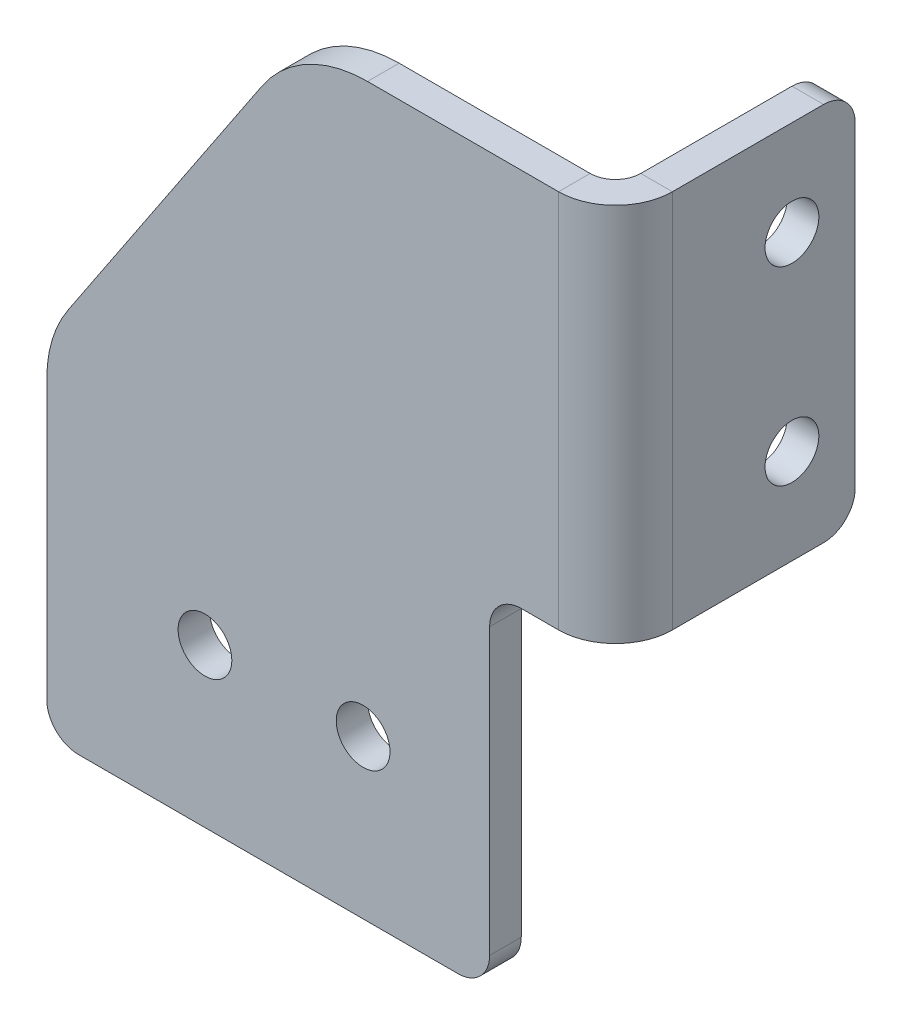
ISO-10303-21;
HEADER;
FILE_DESCRIPTION(('STEP AP214'),'2;1');
FILE_NAME('part.step','',(''),(''),'','','');
FILE_SCHEMA(('AUTOMOTIVE_DESIGN { 1 0 10303 214 1 1 1 1 }'));
ENDSEC;
DATA;
#1=APPLICATION_CONTEXT('core data for automotive mechanical design processes');
#2=APPLICATION_PROTOCOL_DEFINITION('international standard','automotive_design',2000,#1);
#3=PRODUCT_CONTEXT('',#1,'mechanical');
#4=PRODUCT('Part','Part','',(#3));
#5=PRODUCT_RELATED_PRODUCT_CATEGORY('part','',(#4));
#6=PRODUCT_DEFINITION_FORMATION('','',#4);
#7=PRODUCT_DEFINITION_CONTEXT('part definition',#1,'design');
#8=PRODUCT_DEFINITION('design','',#6,#7);
#9=PRODUCT_DEFINITION_SHAPE('','',#8);
#10=(LENGTH_UNIT() NAMED_UNIT(*) SI_UNIT(.MILLI.,.METRE.));
#11=(NAMED_UNIT(*) PLANE_ANGLE_UNIT() SI_UNIT($,.RADIAN.));
#12=(NAMED_UNIT(*) SI_UNIT($,.STERADIAN.) SOLID_ANGLE_UNIT());
#13=UNCERTAINTY_MEASURE_WITH_UNIT(LENGTH_MEASURE(1.E-05),#10,'distance_accuracy_value','');
#14=(GEOMETRIC_REPRESENTATION_CONTEXT(3) GLOBAL_UNCERTAINTY_ASSIGNED_CONTEXT((#13)) GLOBAL_UNIT_ASSIGNED_CONTEXT((#10,
#11,#12)) REPRESENTATION_CONTEXT('',''));
#15=CARTESIAN_POINT('',(0.,0.,0.));
#16=DIRECTION('',(0.,0.,1.));
#17=DIRECTION('',(1.,0.,0.));
#18=AXIS2_PLACEMENT_3D('',#15,#16,#17);
#19=CARTESIAN_POINT('',(-35.1050880620835,-60.,-37.8949119379166));
#20=DIRECTION('',(0.,-1.,0.));
#21=DIRECTION('',(0.,0.,-1.));
#22=AXIS2_PLACEMENT_3D('',#19,#20,#21);
#23=PLANE('',#22);
#24=DIRECTION('',(0.,0.,-1.));
#25=VECTOR('',#24,1.);
#26=CARTESIAN_POINT('',(-35.1050880620835,-60.,-37.8949119379166));
#27=LINE('',#26,#25);
#28=CARTESIAN_POINT('',(-35.1050880620834,-60.,-9.00000000000001));
#29=VERTEX_POINT('',#28);
#30=CARTESIAN_POINT('',(-35.1050880620835,-60.,-32.8949119379166));
#31=VERTEX_POINT('',#30);
#32=EDGE_CURVE('E185',#29,#31,#27,.T.);
#33=ORIENTED_EDGE('',*,*,#32,.T.);
#34=DIRECTION('',(1.,0.,0.));
#35=VECTOR('',#34,1.);
#36=CARTESIAN_POINT('',(-35.1050880620835,-60.,-32.8949119379166));
#37=LINE('',#36,#35);
#38=CARTESIAN_POINT('',(-30.1050880620835,-60.,-32.8949119379166));
#39=VERTEX_POINT('',#38);
#40=EDGE_CURVE('E244',#31,#39,#37,.T.);
#41=ORIENTED_EDGE('',*,*,#40,.T.);
#42=DIRECTION('',(0.,0.,-1.));
#43=VECTOR('',#42,1.);
#44=CARTESIAN_POINT('',(-30.1050880620835,-60.,-37.8949119379166));
#45=LINE('',#44,#43);
#46=CARTESIAN_POINT('',(-30.1050880620834,-59.9999999999999,-9.00000000000002));
#47=VERTEX_POINT('',#46);
#48=EDGE_CURVE('E209',#47,#39,#45,.T.);
#49=ORIENTED_EDGE('',*,*,#48,.F.);
#50=DIRECTION('',(-1.,0.,0.));
#51=VECTOR('',#50,1.);
#52=CARTESIAN_POINT('',(-35.1050880620834,-60.,-9.00000000000001));
#53=LINE('',#52,#51);
#54=EDGE_CURVE('E184',#47,#29,#53,.T.);
#55=ORIENTED_EDGE('',*,*,#54,.T.);
#56=EDGE_LOOP('',(#33,#41,#49,#55));
#57=FACE_BOUND('',#56,.T.);
#58=ADVANCED_FACE('F45',(#57),#23,.T.);
#59=CARTESIAN_POINT('',(-35.1050880620835,0.,-37.8949119379166));
#60=DIRECTION('',(0.,1.,0.));
#61=DIRECTION('',(0.,0.,1.));
#62=AXIS2_PLACEMENT_3D('',#59,#60,#61);
#63=PLANE('',#62);
#64=DIRECTION('',(0.,0.,1.));
#65=VECTOR('',#64,1.);
#66=CARTESIAN_POINT('',(-30.1050880620835,0.,-37.8949119379166));
#67=LINE('',#66,#65);
#68=CARTESIAN_POINT('',(-30.1050880620835,0.,-32.8949119379166));
#69=VERTEX_POINT('',#68);
#70=CARTESIAN_POINT('',(-30.1050880620834,0.,-9.00000000000002));
#71=VERTEX_POINT('',#70);
#72=EDGE_CURVE('E223',#69,#71,#67,.T.);
#73=ORIENTED_EDGE('',*,*,#72,.F.);
#74=DIRECTION('',(1.,0.,0.));
#75=VECTOR('',#74,1.);
#76=CARTESIAN_POINT('',(-35.1050880620835,0.,-32.8949119379166));
#77=LINE('',#76,#75);
#78=CARTESIAN_POINT('',(-35.1050880620835,0.,-32.8949119379166));
#79=VERTEX_POINT('',#78);
#80=EDGE_CURVE('E258',#69,#79,#77,.F.);
#81=ORIENTED_EDGE('',*,*,#80,.T.);
#82=DIRECTION('',(0.,0.,1.));
#83=VECTOR('',#82,1.);
#84=CARTESIAN_POINT('',(-35.1050880620835,0.,-37.8949119379166));
#85=LINE('',#84,#83);
#86=CARTESIAN_POINT('',(-35.1050880620834,0.,-9.00000000000001));
#87=VERTEX_POINT('',#86);
#88=EDGE_CURVE('E205',#79,#87,#85,.T.);
#89=ORIENTED_EDGE('',*,*,#88,.T.);
#90=DIRECTION('',(1.,0.,0.));
#91=VECTOR('',#90,1.);
#92=CARTESIAN_POINT('',(-35.1050880620834,0.,-9.00000000000001));
#93=LINE('',#92,#91);
#94=EDGE_CURVE('E214',#87,#71,#93,.T.);
#95=ORIENTED_EDGE('',*,*,#94,.T.);
#96=EDGE_LOOP('',(#73,#81,#89,#95));
#97=FACE_BOUND('',#96,.T.);
#98=ADVANCED_FACE('F375',(#97),#63,.T.);
#99=CARTESIAN_POINT('',(-35.1050880620835,0.,-37.8949119379166));
#100=DIRECTION('',(-1.,0.,0.));
#101=DIRECTION('',(0.,0.,1.));
#102=AXIS2_PLACEMENT_3D('',#99,#100,#101);
#103=PLANE('',#102);
#104=CARTESIAN_POINT('',(-35.1050880620835,-15.,-27.8949119379166));
#105=DIRECTION('',(-1.,0.,0.));
#106=DIRECTION('',(0.,0.,1.));
#107=AXIS2_PLACEMENT_3D('',#104,#105,#106);
#108=CIRCLE('',#107,4.25000000000001);
#109=CARTESIAN_POINT('',(-35.1050880620835,-15.,-23.6449119379166));
#110=VERTEX_POINT('',#109);
#111=EDGE_CURVE('E284',#110,#110,#108,.T.);
#112=ORIENTED_EDGE('',*,*,#111,.F.);
#113=EDGE_LOOP('',(#112));
#114=FACE_BOUND('',#113,.T.);
#115=CARTESIAN_POINT('',(-35.1050880620835,-45.,-27.8949119379166));
#116=DIRECTION('',(-1.,0.,0.));
#117=DIRECTION('',(0.,0.,1.));
#118=AXIS2_PLACEMENT_3D('',#115,#116,#117);
#119=CIRCLE('',#118,4.25000000000001);
#120=CARTESIAN_POINT('',(-35.1050880620835,-45.,-23.6449119379166));
#121=VERTEX_POINT('',#120);
#122=EDGE_CURVE('E290',#121,#121,#119,.T.);
#123=ORIENTED_EDGE('',*,*,#122,.F.);
#124=EDGE_LOOP('',(#123));
#125=FACE_BOUND('',#124,.T.);
#126=DIRECTION('',(0.,1.,0.));
#127=VECTOR('',#126,1.);
#128=CARTESIAN_POINT('',(-35.1050880620835,0.,-37.8949119379166));
#129=LINE('',#128,#127);
#130=CARTESIAN_POINT('',(-35.1050880620835,-55.,-37.8949119379166));
#131=VERTEX_POINT('',#130);
#132=CARTESIAN_POINT('',(-35.1050880620835,-4.99999999999999,-37.8949119379166));
#133=VERTEX_POINT('',#132);
#134=EDGE_CURVE('E222',#131,#133,#129,.T.);
#135=ORIENTED_EDGE('',*,*,#134,.F.);
#136=CARTESIAN_POINT('',(-35.1050880620835,-55.,-32.8949119379166));
#137=DIRECTION('',(-1.,0.,0.));
#138=DIRECTION('',(0.,0.,1.));
#139=AXIS2_PLACEMENT_3D('',#136,#137,#138);
#140=CIRCLE('',#139,5.);
#141=EDGE_CURVE('E201',#131,#31,#140,.T.);
#142=ORIENTED_EDGE('',*,*,#141,.T.);
#143=ORIENTED_EDGE('',*,*,#32,.F.);
#144=DIRECTION('',(0.,1.,0.));
#145=VECTOR('',#144,1.);
#146=CARTESIAN_POINT('',(-35.1050880620834,0.,-9.00000000000001));
#147=LINE('',#146,#145);
#148=EDGE_CURVE('E173',#29,#87,#147,.T.);
#149=ORIENTED_EDGE('',*,*,#148,.T.);
#150=ORIENTED_EDGE('',*,*,#88,.F.);
#151=CARTESIAN_POINT('',(-35.1050880620835,-4.99999999999999,-32.8949119379166));
#152=DIRECTION('',(-1.,0.,0.));
#153=DIRECTION('',(0.,0.,1.));
#154=AXIS2_PLACEMENT_3D('',#151,#152,#153);
#155=CIRCLE('',#154,5.);
#156=EDGE_CURVE('E255',#79,#133,#155,.T.);
#157=ORIENTED_EDGE('',*,*,#156,.T.);
#158=EDGE_LOOP('',(#135,#142,#143,#149,#150,#157));
#159=FACE_BOUND('',#158,.T.);
#160=ADVANCED_FACE('F199',(#114,#125,#159),#103,.T.);
#161=CARTESIAN_POINT('',(-35.1050880620835,0.,-37.8949119379166));
#162=DIRECTION('',(0.,0.,-1.));
#163=DIRECTION('',(0.,1.,0.));
#164=AXIS2_PLACEMENT_3D('',#161,#162,#163);
#165=PLANE('',#164);
#166=DIRECTION('',(0.,1.,0.));
#167=VECTOR('',#166,1.);
#168=CARTESIAN_POINT('',(-30.1050880620835,0.,-37.8949119379166));
#169=LINE('',#168,#167);
#170=CARTESIAN_POINT('',(-30.1050880620835,-55.,-37.8949119379166));
#171=VERTEX_POINT('',#170);
#172=CARTESIAN_POINT('',(-30.1050880620835,-4.99999999999999,-37.8949119379166));
#173=VERTEX_POINT('',#172);
#174=EDGE_CURVE('E225',#171,#173,#169,.T.);
#175=ORIENTED_EDGE('',*,*,#174,.F.);
#176=DIRECTION('',(1.,0.,0.));
#177=VECTOR('',#176,1.);
#178=CARTESIAN_POINT('',(-35.1050880620835,-55.,-37.8949119379166));
#179=LINE('',#178,#177);
#180=EDGE_CURVE('E253',#171,#131,#179,.F.);
#181=ORIENTED_EDGE('',*,*,#180,.T.);
#182=ORIENTED_EDGE('',*,*,#134,.T.);
#183=DIRECTION('',(1.,0.,0.));
#184=VECTOR('',#183,1.);
#185=CARTESIAN_POINT('',(-35.1050880620835,-4.99999999999999,-37.8949119379166));
#186=LINE('',#185,#184);
#187=EDGE_CURVE('E250',#133,#173,#186,.T.);
#188=ORIENTED_EDGE('',*,*,#187,.T.);
#189=EDGE_LOOP('',(#175,#181,#182,#188));
#190=FACE_BOUND('',#189,.T.);
#191=ADVANCED_FACE('F363',(#190),#165,.T.);
#192=CARTESIAN_POINT('',(-30.1050880620835,0.,-37.8949119379166));
#193=DIRECTION('',(-1.,0.,0.));
#194=DIRECTION('',(0.,0.,1.));
#195=AXIS2_PLACEMENT_3D('',#192,#193,#194);
#196=PLANE('',#195);
#197=CARTESIAN_POINT('',(-30.1050880620835,-15.,-27.8949119379166));
#198=DIRECTION('',(-1.,0.,0.));
#199=DIRECTION('',(0.,0.,1.));
#200=AXIS2_PLACEMENT_3D('',#197,#198,#199);
#201=CIRCLE('',#200,4.25000000000001);
#202=CARTESIAN_POINT('',(-30.1050880620835,-15.,-23.6449119379166));
#203=VERTEX_POINT('',#202);
#204=EDGE_CURVE('E49',#203,#203,#201,.T.);
#205=ORIENTED_EDGE('',*,*,#204,.T.);
#206=EDGE_LOOP('',(#205));
#207=FACE_BOUND('',#206,.T.);
#208=CARTESIAN_POINT('',(-30.1050880620835,-45.,-27.8949119379166));
#209=DIRECTION('',(-1.,0.,0.));
#210=DIRECTION('',(0.,0.,1.));
#211=AXIS2_PLACEMENT_3D('',#208,#209,#210);
#212=CIRCLE('',#211,4.25000000000001);
#213=CARTESIAN_POINT('',(-30.1050880620835,-45.,-23.6449119379166));
#214=VERTEX_POINT('',#213);
#215=EDGE_CURVE('E282',#214,#214,#212,.T.);
#216=ORIENTED_EDGE('',*,*,#215,.T.);
#217=EDGE_LOOP('',(#216));
#218=FACE_BOUND('',#217,.T.);
#219=ORIENTED_EDGE('',*,*,#48,.T.);
#220=CARTESIAN_POINT('',(-30.1050880620835,-55.,-32.8949119379166));
#221=DIRECTION('',(-1.,0.,0.));
#222=DIRECTION('',(0.,0.,1.));
#223=AXIS2_PLACEMENT_3D('',#220,#221,#222);
#224=CIRCLE('',#223,5.);
#225=EDGE_CURVE('E248',#39,#171,#224,.F.);
#226=ORIENTED_EDGE('',*,*,#225,.T.);
#227=ORIENTED_EDGE('',*,*,#174,.T.);
#228=CARTESIAN_POINT('',(-30.1050880620835,-4.99999999999999,-32.8949119379166));
#229=DIRECTION('',(-1.,0.,0.));
#230=DIRECTION('',(0.,0.,1.));
#231=AXIS2_PLACEMENT_3D('',#228,#229,#230);
#232=CIRCLE('',#231,5.);
#233=EDGE_CURVE('E246',#173,#69,#232,.F.);
#234=ORIENTED_EDGE('',*,*,#233,.T.);
#235=ORIENTED_EDGE('',*,*,#72,.T.);
#236=DIRECTION('',(0.,1.,0.));
#237=VECTOR('',#236,1.);
#238=CARTESIAN_POINT('',(-30.1050880620834,0.,-9.00000000000002));
#239=LINE('',#238,#237);
#240=EDGE_CURVE('E211',#47,#71,#239,.T.);
#241=ORIENTED_EDGE('',*,*,#240,.F.);
#242=EDGE_LOOP('',(#219,#226,#227,#234,#235,#241));
#243=FACE_BOUND('',#242,.T.);
#244=ADVANCED_FACE('F359',(#207,#218,#243),#196,.F.);
#245=CARTESIAN_POINT('',(-120.,-60.,-5.));
#246=DIRECTION('',(-0.832050294337844,0.554700196225229,0.));
#247=DIRECTION('',(-0.554700196225229,-0.832050294337844,0.));
#248=AXIS2_PLACEMENT_3D('',#245,#246,#247);
#249=PLANE('',#248);
#250=DIRECTION('',(-0.554700196225229,-0.832050294337844,0.));
#251=VECTOR('',#250,1.);
#252=CARTESIAN_POINT('',(-120.,-60.,-5.));
#253=LINE('',#252,#251);
#254=CARTESIAN_POINT('',(-85.9373307169969,-8.90599607549541,-5.));
#255=VERTEX_POINT('',#254);
#256=CARTESIAN_POINT('',(-116.641005886757,-54.9615088301353,-5.));
#257=VERTEX_POINT('',#256);
#258=EDGE_CURVE('E347',#255,#257,#253,.T.);
#259=ORIENTED_EDGE('',*,*,#258,.T.);
#260=DIRECTION('',(0.,0.,1.));
#261=VECTOR('',#260,1.);
#262=CARTESIAN_POINT('',(-116.641005886757,-54.9615088301353,-5.));
#263=LINE('',#262,#261);
#264=CARTESIAN_POINT('',(-116.641005886757,-54.9615088301353,0.));
#265=VERTEX_POINT('',#264);
#266=EDGE_CURVE('E228',#257,#265,#263,.T.);
#267=ORIENTED_EDGE('',*,*,#266,.T.);
#268=DIRECTION('',(-0.554700196225229,-0.832050294337844,0.));
#269=VECTOR('',#268,1.);
#270=CARTESIAN_POINT('',(-120.,-60.,0.));
#271=LINE('',#270,#269);
#272=CARTESIAN_POINT('',(-85.9373307169969,-8.90599607549541,0.));
#273=VERTEX_POINT('',#272);
#274=EDGE_CURVE('E326',#273,#265,#271,.T.);
#275=ORIENTED_EDGE('',*,*,#274,.F.);
#276=DIRECTION('',(0.,0.,1.));
#277=VECTOR('',#276,1.);
#278=CARTESIAN_POINT('',(-85.9373307169969,-8.90599607549542,-5.));
#279=LINE('',#278,#277);
#280=EDGE_CURVE('E220',#273,#255,#279,.F.);
#281=ORIENTED_EDGE('',*,*,#280,.T.);
#282=EDGE_LOOP('',(#259,#267,#275,#281));
#283=FACE_BOUND('',#282,.T.);
#284=ADVANCED_FACE('F402',(#283),#249,.T.);
#285=CARTESIAN_POINT('',(-120.,-115.,-5.));
#286=DIRECTION('',(-1.,0.,0.));
#287=DIRECTION('',(0.,0.,1.));
#288=AXIS2_PLACEMENT_3D('',#285,#286,#287);
#289=PLANE('',#288);
#290=DIRECTION('',(0.,-1.,0.));
#291=VECTOR('',#290,1.);
#292=CARTESIAN_POINT('',(-120.,-115.,-5.));
#293=LINE('',#292,#291);
#294=CARTESIAN_POINT('',(-120.,-66.0555127546399,-5.));
#295=VERTEX_POINT('',#294);
#296=CARTESIAN_POINT('',(-120.,-110.,-5.));
#297=VERTEX_POINT('',#296);
#298=EDGE_CURVE('E344',#295,#297,#293,.T.);
#299=ORIENTED_EDGE('',*,*,#298,.T.);
#300=DIRECTION('',(0.,0.,1.));
#301=VECTOR('',#300,1.);
#302=CARTESIAN_POINT('',(-120.,-110.,-5.));
#303=LINE('',#302,#301);
#304=CARTESIAN_POINT('',(-120.,-110.,0.));
#305=VERTEX_POINT('',#304);
#306=EDGE_CURVE('E260',#297,#305,#303,.T.);
#307=ORIENTED_EDGE('',*,*,#306,.T.);
#308=DIRECTION('',(0.,-1.,0.));
#309=VECTOR('',#308,1.);
#310=CARTESIAN_POINT('',(-120.,-115.,0.));
#311=LINE('',#310,#309);
#312=CARTESIAN_POINT('',(-120.,-66.0555127546399,0.));
#313=VERTEX_POINT('',#312);
#314=EDGE_CURVE('E323',#313,#305,#311,.T.);
#315=ORIENTED_EDGE('',*,*,#314,.F.);
#316=DIRECTION('',(0.,0.,1.));
#317=VECTOR('',#316,1.);
#318=CARTESIAN_POINT('',(-120.,-66.0555127546399,-5.));
#319=LINE('',#318,#317);
#320=EDGE_CURVE('E235',#313,#295,#319,.F.);
#321=ORIENTED_EDGE('',*,*,#320,.T.);
#322=EDGE_LOOP('',(#299,#307,#315,#321));
#323=FACE_BOUND('',#322,.T.);
#324=ADVANCED_FACE('F443',(#323),#289,.T.);
#325=CARTESIAN_POINT('',(-50.,-115.,-5.));
#326=DIRECTION('',(0.,-1.,0.));
#327=DIRECTION('',(1.,0.,0.));
#328=AXIS2_PLACEMENT_3D('',#325,#326,#327);
#329=PLANE('',#328);
#330=DIRECTION('',(1.,0.,0.));
#331=VECTOR('',#330,1.);
#332=CARTESIAN_POINT('',(-50.,-115.,0.));
#333=LINE('',#332,#331);
#334=CARTESIAN_POINT('',(-115.,-115.,0.));
#335=VERTEX_POINT('',#334);
#336=CARTESIAN_POINT('',(-55.,-115.,0.));
#337=VERTEX_POINT('',#336);
#338=EDGE_CURVE('E320',#335,#337,#333,.T.);
#339=ORIENTED_EDGE('',*,*,#338,.F.);
#340=DIRECTION('',(0.,0.,1.));
#341=VECTOR('',#340,1.);
#342=CARTESIAN_POINT('',(-115.,-115.,-5.));
#343=LINE('',#342,#341);
#344=CARTESIAN_POINT('',(-115.,-115.,-5.));
#345=VERTEX_POINT('',#344);
#346=EDGE_CURVE('E270',#335,#345,#343,.F.);
#347=ORIENTED_EDGE('',*,*,#346,.T.);
#348=DIRECTION('',(1.,0.,0.));
#349=VECTOR('',#348,1.);
#350=CARTESIAN_POINT('',(-50.,-115.,-5.));
#351=LINE('',#350,#349);
#352=CARTESIAN_POINT('',(-55.,-115.,-5.));
#353=VERTEX_POINT('',#352);
#354=EDGE_CURVE('E341',#345,#353,#351,.T.);
#355=ORIENTED_EDGE('',*,*,#354,.T.);
#356=DIRECTION('',(0.,0.,1.));
#357=VECTOR('',#356,1.);
#358=CARTESIAN_POINT('',(-55.,-115.,-5.));
#359=LINE('',#358,#357);
#360=EDGE_CURVE('E267',#353,#337,#359,.T.);
#361=ORIENTED_EDGE('',*,*,#360,.T.);
#362=EDGE_LOOP('',(#339,#347,#355,#361));
#363=FACE_BOUND('',#362,.T.);
#364=ADVANCED_FACE('F436',(#363),#329,.T.);
#365=CARTESIAN_POINT('',(-50.,-60.,-5.));
#366=DIRECTION('',(1.,0.,0.));
#367=DIRECTION('',(0.,1.,0.));
#368=AXIS2_PLACEMENT_3D('',#365,#366,#367);
#369=PLANE('',#368);
#370=DIRECTION('',(0.,1.,0.));
#371=VECTOR('',#370,1.);
#372=CARTESIAN_POINT('',(-50.,-60.,0.));
#373=LINE('',#372,#371);
#374=CARTESIAN_POINT('',(-50.,-110.,0.));
#375=VERTEX_POINT('',#374);
#376=CARTESIAN_POINT('',(-50.,-65.,0.));
#377=VERTEX_POINT('',#376);
#378=EDGE_CURVE('E317',#375,#377,#373,.T.);
#379=ORIENTED_EDGE('',*,*,#378,.F.);
#380=DIRECTION('',(0.,0.,1.));
#381=VECTOR('',#380,1.);
#382=CARTESIAN_POINT('',(-50.,-110.,-5.));
#383=LINE('',#382,#381);
#384=CARTESIAN_POINT('',(-50.,-110.,-5.));
#385=VERTEX_POINT('',#384);
#386=EDGE_CURVE('E67',#375,#385,#383,.F.);
#387=ORIENTED_EDGE('',*,*,#386,.T.);
#388=DIRECTION('',(0.,1.,0.));
#389=VECTOR('',#388,1.);
#390=CARTESIAN_POINT('',(-50.,-60.,-5.));
#391=LINE('',#390,#389);
#392=CARTESIAN_POINT('',(-50.,-65.,-5.));
#393=VERTEX_POINT('',#392);
#394=EDGE_CURVE('E339',#385,#393,#391,.T.);
#395=ORIENTED_EDGE('',*,*,#394,.T.);
#396=DIRECTION('',(0.,0.,1.));
#397=VECTOR('',#396,1.);
#398=CARTESIAN_POINT('',(-50.,-65.,0.));
#399=LINE('',#398,#397);
#400=EDGE_CURVE('E276',#393,#377,#399,.T.);
#401=ORIENTED_EDGE('',*,*,#400,.T.);
#402=EDGE_LOOP('',(#379,#387,#395,#401));
#403=FACE_BOUND('',#402,.T.);
#404=ADVANCED_FACE('F427',(#403),#369,.T.);
#405=CARTESIAN_POINT('',(0.,0.,-5.));
#406=DIRECTION('',(0.,0.,-1.));
#407=DIRECTION('',(-1.,0.,0.));
#408=AXIS2_PLACEMENT_3D('',#405,#406,#407);
#409=PLANE('',#408);
#410=CARTESIAN_POINT('',(-70.,-90.,-5.));
#411=DIRECTION('',(0.,0.,-1.));
#412=DIRECTION('',(-1.,0.,0.));
#413=AXIS2_PLACEMENT_3D('',#410,#411,#412);
#414=CIRCLE('',#413,4.25000000000001);
#415=CARTESIAN_POINT('',(-74.25,-90.,-5.));
#416=VERTEX_POINT('',#415);
#417=EDGE_CURVE('E305',#416,#416,#414,.T.);
#418=ORIENTED_EDGE('',*,*,#417,.F.);
#419=EDGE_LOOP('',(#418));
#420=FACE_BOUND('',#419,.T.);
#421=CARTESIAN_POINT('',(-95.,-90.,-5.));
#422=DIRECTION('',(0.,0.,-1.));
#423=DIRECTION('',(-1.,0.,0.));
#424=AXIS2_PLACEMENT_3D('',#421,#422,#423);
#425=CIRCLE('',#424,4.25000000000001);
#426=CARTESIAN_POINT('',(-99.25,-90.,-5.));
#427=VERTEX_POINT('',#426);
#428=EDGE_CURVE('E300',#427,#427,#425,.T.);
#429=ORIENTED_EDGE('',*,*,#428,.F.);
#430=EDGE_LOOP('',(#429));
#431=FACE_BOUND('',#430,.T.);
#432=ORIENTED_EDGE('',*,*,#354,.F.);
#433=CARTESIAN_POINT('',(-115.,-110.,-5.));
#434=DIRECTION('',(0.,0.,-1.));
#435=DIRECTION('',(-1.,0.,0.));
#436=AXIS2_PLACEMENT_3D('',#433,#434,#435);
#437=CIRCLE('',#436,5.);
#438=EDGE_CURVE('E274',#345,#297,#437,.T.);
#439=ORIENTED_EDGE('',*,*,#438,.T.);
#440=ORIENTED_EDGE('',*,*,#298,.F.);
#441=CARTESIAN_POINT('',(-100.,-66.0555127546399,-5.));
#442=DIRECTION('',(0.,0.,-1.));
#443=DIRECTION('',(-1.,0.,0.));
#444=AXIS2_PLACEMENT_3D('',#441,#442,#443);
#445=CIRCLE('',#444,20.);
#446=EDGE_CURVE('E239',#295,#257,#445,.T.);
#447=ORIENTED_EDGE('',*,*,#446,.T.);
#448=ORIENTED_EDGE('',*,*,#258,.F.);
#449=CARTESIAN_POINT('',(-69.2963248302401,-20.,-5.));
#450=DIRECTION('',(0.,0.,-1.));
#451=DIRECTION('',(-1.,0.,0.));
#452=AXIS2_PLACEMENT_3D('',#449,#450,#451);
#453=CIRCLE('',#452,20.);
#454=CARTESIAN_POINT('',(-69.2963248302401,0.,-5.));
#455=VERTEX_POINT('',#454);
#456=EDGE_CURVE('E237',#255,#455,#453,.T.);
#457=ORIENTED_EDGE('',*,*,#456,.T.);
#458=DIRECTION('',(-1.,0.,0.));
#459=VECTOR('',#458,1.);
#460=CARTESIAN_POINT('',(0.,0.,-5.));
#461=LINE('',#460,#459);
#462=CARTESIAN_POINT('',(-39.1050880620834,0.,-5.));
#463=VERTEX_POINT('',#462);
#464=EDGE_CURVE('E314',#463,#455,#461,.T.);
#465=ORIENTED_EDGE('',*,*,#464,.F.);
#466=DIRECTION('',(0.,1.,0.));
#467=VECTOR('',#466,1.);
#468=CARTESIAN_POINT('',(-39.1050880620834,0.,-5.));
#469=LINE('',#468,#467);
#470=CARTESIAN_POINT('',(-39.1050880620834,-60.,-5.));
#471=VERTEX_POINT('',#470);
#472=EDGE_CURVE('E310',#471,#463,#469,.T.);
#473=ORIENTED_EDGE('',*,*,#472,.F.);
#474=DIRECTION('',(1.,0.,0.));
#475=VECTOR('',#474,1.);
#476=CARTESIAN_POINT('',(0.,-60.,-5.));
#477=LINE('',#476,#475);
#478=CARTESIAN_POINT('',(-45.,-60.,-5.));
#479=VERTEX_POINT('',#478);
#480=EDGE_CURVE('E337',#479,#471,#477,.T.);
#481=ORIENTED_EDGE('',*,*,#480,.F.);
#482=CARTESIAN_POINT('',(-45.,-65.,-5.));
#483=DIRECTION('',(0.,0.,-1.));
#484=DIRECTION('',(-1.,0.,0.));
#485=AXIS2_PLACEMENT_3D('',#482,#483,#484);
#486=CIRCLE('',#485,5.);
#487=EDGE_CURVE('E12',#479,#393,#486,.F.);
#488=ORIENTED_EDGE('',*,*,#487,.T.);
#489=ORIENTED_EDGE('',*,*,#394,.F.);
#490=CARTESIAN_POINT('',(-55.,-110.,-5.));
#491=DIRECTION('',(0.,0.,-1.));
#492=DIRECTION('',(-1.,0.,0.));
#493=AXIS2_PLACEMENT_3D('',#490,#491,#492);
#494=CIRCLE('',#493,5.);
#495=EDGE_CURVE('E272',#385,#353,#494,.T.);
#496=ORIENTED_EDGE('',*,*,#495,.T.);
#497=EDGE_LOOP('',(#432,#439,#440,#447,#448,#457,#465,#473,#481,#488,#489,#496));
#498=FACE_BOUND('',#497,.T.);
#499=ADVANCED_FACE('F419',(#420,#431,#498),#409,.T.);
#500=CARTESIAN_POINT('',(0.,-60.,-5.));
#501=DIRECTION('',(0.,-1.,0.));
#502=DIRECTION('',(1.,0.,0.));
#503=AXIS2_PLACEMENT_3D('',#500,#501,#502);
#504=PLANE('',#503);
#505=DIRECTION('',(1.,0.,0.));
#506=VECTOR('',#505,1.);
#507=CARTESIAN_POINT('',(0.,-60.,0.));
#508=LINE('',#507,#506);
#509=CARTESIAN_POINT('',(-45.,-60.,0.));
#510=VERTEX_POINT('',#509);
#511=CARTESIAN_POINT('',(-39.1050880620834,-60.,0.));
#512=VERTEX_POINT('',#511);
#513=EDGE_CURVE('E335',#510,#512,#508,.T.);
#514=ORIENTED_EDGE('',*,*,#513,.F.);
#515=DIRECTION('',(0.,0.,1.));
#516=VECTOR('',#515,1.);
#517=CARTESIAN_POINT('',(-45.,-60.,-5.));
#518=LINE('',#517,#516);
#519=EDGE_CURVE('E280',#510,#479,#518,.F.);
#520=ORIENTED_EDGE('',*,*,#519,.T.);
#521=ORIENTED_EDGE('',*,*,#480,.T.);
#522=DIRECTION('',(0.,0.,-1.));
#523=VECTOR('',#522,1.);
#524=CARTESIAN_POINT('',(-39.1050880620834,-60.,-5.));
#525=LINE('',#524,#523);
#526=EDGE_CURVE('E194',#512,#471,#525,.T.);
#527=ORIENTED_EDGE('',*,*,#526,.F.);
#528=EDGE_LOOP('',(#514,#520,#521,#527));
#529=FACE_BOUND('',#528,.T.);
#530=ADVANCED_FACE('F464',(#529),#504,.T.);
#531=CARTESIAN_POINT('',(0.,0.,0.));
#532=DIRECTION('',(0.,0.,-1.));
#533=DIRECTION('',(-1.,0.,0.));
#534=AXIS2_PLACEMENT_3D('',#531,#532,#533);
#535=PLANE('',#534);
#536=CARTESIAN_POINT('',(-70.,-90.,0.));
#537=DIRECTION('',(0.,0.,1.));
#538=DIRECTION('',(1.,0.,0.));
#539=AXIS2_PLACEMENT_3D('',#536,#537,#538);
#540=CIRCLE('',#539,4.25000000000001);
#541=CARTESIAN_POINT('',(-65.75,-90.,0.));
#542=VERTEX_POINT('',#541);
#543=EDGE_CURVE('E297',#542,#542,#540,.T.);
#544=ORIENTED_EDGE('',*,*,#543,.F.);
#545=EDGE_LOOP('',(#544));
#546=FACE_BOUND('',#545,.T.);
#547=CARTESIAN_POINT('',(-95.,-90.,0.));
#548=DIRECTION('',(0.,0.,1.));
#549=DIRECTION('',(1.,0.,0.));
#550=AXIS2_PLACEMENT_3D('',#547,#548,#549);
#551=CIRCLE('',#550,4.25000000000001);
#552=CARTESIAN_POINT('',(-90.75,-90.,0.));
#553=VERTEX_POINT('',#552);
#554=EDGE_CURVE('E288',#553,#553,#551,.T.);
#555=ORIENTED_EDGE('',*,*,#554,.F.);
#556=EDGE_LOOP('',(#555));
#557=FACE_BOUND('',#556,.T.);
#558=ORIENTED_EDGE('',*,*,#314,.T.);
#559=CARTESIAN_POINT('',(-115.,-110.,0.));
#560=DIRECTION('',(0.,0.,-1.));
#561=DIRECTION('',(-1.,0.,0.));
#562=AXIS2_PLACEMENT_3D('',#559,#560,#561);
#563=CIRCLE('',#562,5.);
#564=EDGE_CURVE('E265',#305,#335,#563,.F.);
#565=ORIENTED_EDGE('',*,*,#564,.T.);
#566=ORIENTED_EDGE('',*,*,#338,.T.);
#567=CARTESIAN_POINT('',(-55.,-110.,0.));
#568=DIRECTION('',(0.,0.,-1.));
#569=DIRECTION('',(-1.,0.,0.));
#570=AXIS2_PLACEMENT_3D('',#567,#568,#569);
#571=CIRCLE('',#570,5.);
#572=EDGE_CURVE('E263',#337,#375,#571,.F.);
#573=ORIENTED_EDGE('',*,*,#572,.T.);
#574=ORIENTED_EDGE('',*,*,#378,.T.);
#575=CARTESIAN_POINT('',(-45.,-65.,0.));
#576=DIRECTION('',(0.,0.,-1.));
#577=DIRECTION('',(-1.,0.,0.));
#578=AXIS2_PLACEMENT_3D('',#575,#576,#577);
#579=CIRCLE('',#578,5.);
#580=EDGE_CURVE('E54',#377,#510,#579,.T.);
#581=ORIENTED_EDGE('',*,*,#580,.T.);
#582=ORIENTED_EDGE('',*,*,#513,.T.);
#583=DIRECTION('',(0.,1.,0.));
#584=VECTOR('',#583,1.);
#585=CARTESIAN_POINT('',(-39.1050880620834,0.,0.));
#586=LINE('',#585,#584);
#587=CARTESIAN_POINT('',(-39.1050880620834,0.,0.));
#588=VERTEX_POINT('',#587);
#589=EDGE_CURVE('E332',#512,#588,#586,.T.);
#590=ORIENTED_EDGE('',*,*,#589,.T.);
#591=DIRECTION('',(-1.,0.,0.));
#592=VECTOR('',#591,1.);
#593=CARTESIAN_POINT('',(0.,0.,0.));
#594=LINE('',#593,#592);
#595=CARTESIAN_POINT('',(-69.2963248302401,0.,0.));
#596=VERTEX_POINT('',#595);
#597=EDGE_CURVE('E329',#588,#596,#594,.T.);
#598=ORIENTED_EDGE('',*,*,#597,.T.);
#599=CARTESIAN_POINT('',(-69.2963248302401,-20.,0.));
#600=DIRECTION('',(0.,0.,-1.));
#601=DIRECTION('',(-1.,0.,0.));
#602=AXIS2_PLACEMENT_3D('',#599,#600,#601);
#603=CIRCLE('',#602,20.);
#604=EDGE_CURVE('E231',#596,#273,#603,.F.);
#605=ORIENTED_EDGE('',*,*,#604,.T.);
#606=ORIENTED_EDGE('',*,*,#274,.T.);
#607=CARTESIAN_POINT('',(-100.,-66.0555127546399,0.));
#608=DIRECTION('',(0.,0.,-1.));
#609=DIRECTION('',(-1.,0.,0.));
#610=AXIS2_PLACEMENT_3D('',#607,#608,#609);
#611=CIRCLE('',#610,20.);
#612=EDGE_CURVE('E233',#265,#313,#611,.F.);
#613=ORIENTED_EDGE('',*,*,#612,.T.);
#614=EDGE_LOOP('',(#558,#565,#566,#573,#574,#581,#582,#590,#598,#605,#606,#613));
#615=FACE_BOUND('',#614,.T.);
#616=ADVANCED_FACE('F429',(#546,#557,#615),#535,.F.);
#617=CARTESIAN_POINT('',(0.,0.,-5.));
#618=DIRECTION('',(0.,1.,0.));
#619=DIRECTION('',(-1.,0.,0.));
#620=AXIS2_PLACEMENT_3D('',#617,#618,#619);
#621=PLANE('',#620);
#622=ORIENTED_EDGE('',*,*,#464,.T.);
#623=DIRECTION('',(0.,0.,1.));
#624=VECTOR('',#623,1.);
#625=CARTESIAN_POINT('',(-69.2963248302401,0.,-5.));
#626=LINE('',#625,#624);
#627=EDGE_CURVE('E241',#455,#596,#626,.T.);
#628=ORIENTED_EDGE('',*,*,#627,.T.);
#629=ORIENTED_EDGE('',*,*,#597,.F.);
#630=DIRECTION('',(0.,0.,1.));
#631=VECTOR('',#630,1.);
#632=CARTESIAN_POINT('',(-39.1050880620834,0.,-5.));
#633=LINE('',#632,#631);
#634=EDGE_CURVE('E351',#463,#588,#633,.T.);
#635=ORIENTED_EDGE('',*,*,#634,.F.);
#636=EDGE_LOOP('',(#622,#628,#629,#635));
#637=FACE_BOUND('',#636,.T.);
#638=ADVANCED_FACE('F422',(#637),#621,.T.);
#639=CARTESIAN_POINT('',(-39.1050880620834,-60.,-9.));
#640=DIRECTION('',(0.,1.,0.));
#641=DIRECTION('',(0.,0.,1.));
#642=AXIS2_PLACEMENT_3D('',#639,#640,#641);
#643=PLANE('',#642);
#644=ORIENTED_EDGE('',*,*,#54,.F.);
#645=CARTESIAN_POINT('',(-39.1050880620834,-60.,-9.));
#646=DIRECTION('',(0.,-1.,0.));
#647=DIRECTION('',(1.,0.,0.));
#648=AXIS2_PLACEMENT_3D('',#645,#646,#647);
#649=CIRCLE('',#648,9.);
#650=EDGE_CURVE('E307',#47,#512,#649,.T.);
#651=ORIENTED_EDGE('',*,*,#650,.T.);
#652=ORIENTED_EDGE('',*,*,#526,.T.);
#653=CARTESIAN_POINT('',(-39.1050880620834,-60.,-9.));
#654=DIRECTION('',(0.,-1.,0.));
#655=DIRECTION('',(0.,0.,1.));
#656=AXIS2_PLACEMENT_3D('',#653,#654,#655);
#657=CIRCLE('',#656,4.);
#658=EDGE_CURVE('E177',#29,#471,#657,.T.);
#659=ORIENTED_EDGE('',*,*,#658,.F.);
#660=EDGE_LOOP('',(#644,#651,#652,#659));
#661=FACE_BOUND('',#660,.T.);
#662=ADVANCED_FACE('F189',(#661),#643,.F.);
#663=CARTESIAN_POINT('',(-39.1050880620834,0.,-9.));
#664=DIRECTION('',(0.,-1.,0.));
#665=DIRECTION('',(0.,0.,-1.));
#666=AXIS2_PLACEMENT_3D('',#663,#664,#665);
#667=PLANE('',#666);
#668=CARTESIAN_POINT('',(-39.1050880620834,0.,-9.));
#669=DIRECTION('',(0.,-1.,0.));
#670=DIRECTION('',(1.,0.,0.));
#671=AXIS2_PLACEMENT_3D('',#668,#669,#670);
#672=CIRCLE('',#671,9.);
#673=EDGE_CURVE('E195',#588,#71,#672,.F.);
#674=ORIENTED_EDGE('',*,*,#673,.T.);
#675=ORIENTED_EDGE('',*,*,#94,.F.);
#676=CARTESIAN_POINT('',(-39.1050880620834,0.,-9.));
#677=DIRECTION('',(0.,1.,0.));
#678=DIRECTION('',(0.,0.,-1.));
#679=AXIS2_PLACEMENT_3D('',#676,#677,#678);
#680=CIRCLE('',#679,4.);
#681=EDGE_CURVE('E179',#463,#87,#680,.T.);
#682=ORIENTED_EDGE('',*,*,#681,.F.);
#683=ORIENTED_EDGE('',*,*,#634,.T.);
#684=EDGE_LOOP('',(#674,#675,#682,#683));
#685=FACE_BOUND('',#684,.T.);
#686=ADVANCED_FACE('F372',(#685),#667,.F.);
#687=CARTESIAN_POINT('',(-39.1050880620834,31.0675666494622,-9.));
#688=DIRECTION('',(0.,-1.,0.));
#689=DIRECTION('',(1.,0.,0.));
#690=AXIS2_PLACEMENT_3D('',#687,#688,#689);
#691=CYLINDRICAL_SURFACE('',#690,4.);
#692=ORIENTED_EDGE('',*,*,#472,.T.);
#693=ORIENTED_EDGE('',*,*,#681,.T.);
#694=ORIENTED_EDGE('',*,*,#148,.F.);
#695=ORIENTED_EDGE('',*,*,#658,.T.);
#696=EDGE_LOOP('',(#692,#693,#694,#695));
#697=FACE_BOUND('',#696,.T.);
#698=ADVANCED_FACE('F176',(#697),#691,.F.);
#699=CARTESIAN_POINT('',(-39.1050880620834,31.0675666494622,-9.));
#700=DIRECTION('',(0.,-1.,0.));
#701=DIRECTION('',(1.,0.,0.));
#702=AXIS2_PLACEMENT_3D('',#699,#700,#701);
#703=CYLINDRICAL_SURFACE('',#702,9.);
#704=ORIENTED_EDGE('',*,*,#589,.F.);
#705=ORIENTED_EDGE('',*,*,#650,.F.);
#706=ORIENTED_EDGE('',*,*,#240,.T.);
#707=ORIENTED_EDGE('',*,*,#673,.F.);
#708=EDGE_LOOP('',(#704,#705,#706,#707));
#709=FACE_BOUND('',#708,.T.);
#710=ADVANCED_FACE('F370',(#709),#703,.T.);
#711=CARTESIAN_POINT('',(-95.,-90.,-10.));
#712=DIRECTION('',(0.,0.,1.));
#713=DIRECTION('',(1.,0.,0.));
#714=AXIS2_PLACEMENT_3D('',#711,#712,#713);
#715=CYLINDRICAL_SURFACE('',#714,4.25000000000001);
#716=ORIENTED_EDGE('',*,*,#428,.T.);
#717=EDGE_LOOP('',(#716));
#718=FACE_BOUND('',#717,.T.);
#719=ORIENTED_EDGE('',*,*,#554,.T.);
#720=EDGE_LOOP('',(#719));
#721=FACE_BOUND('',#720,.T.);
#722=ADVANCED_FACE('F495',(#718,#721),#715,.F.);
#723=CARTESIAN_POINT('',(-70.,-90.,-10.));
#724=DIRECTION('',(0.,0.,1.));
#725=DIRECTION('',(1.,0.,0.));
#726=AXIS2_PLACEMENT_3D('',#723,#724,#725);
#727=CYLINDRICAL_SURFACE('',#726,4.25000000000001);
#728=ORIENTED_EDGE('',*,*,#417,.T.);
#729=EDGE_LOOP('',(#728));
#730=FACE_BOUND('',#729,.T.);
#731=ORIENTED_EDGE('',*,*,#543,.T.);
#732=EDGE_LOOP('',(#731));
#733=FACE_BOUND('',#732,.T.);
#734=ADVANCED_FACE('F408',(#730,#733),#727,.F.);
#735=CARTESIAN_POINT('',(-100.,-66.0555127546399,-5.));
#736=DIRECTION('',(0.,0.,1.));
#737=DIRECTION('',(1.,0.,0.));
#738=AXIS2_PLACEMENT_3D('',#735,#736,#737);
#739=CYLINDRICAL_SURFACE('',#738,20.);
#740=ORIENTED_EDGE('',*,*,#446,.F.);
#741=ORIENTED_EDGE('',*,*,#320,.F.);
#742=ORIENTED_EDGE('',*,*,#612,.F.);
#743=ORIENTED_EDGE('',*,*,#266,.F.);
#744=EDGE_LOOP('',(#740,#741,#742,#743));
#745=FACE_BOUND('',#744,.T.);
#746=ADVANCED_FACE('F405',(#745),#739,.T.);
#747=CARTESIAN_POINT('',(-69.2963248302401,-20.,-5.));
#748=DIRECTION('',(0.,0.,1.));
#749=DIRECTION('',(1.,0.,0.));
#750=AXIS2_PLACEMENT_3D('',#747,#748,#749);
#751=CYLINDRICAL_SURFACE('',#750,20.);
#752=ORIENTED_EDGE('',*,*,#456,.F.);
#753=ORIENTED_EDGE('',*,*,#280,.F.);
#754=ORIENTED_EDGE('',*,*,#604,.F.);
#755=ORIENTED_EDGE('',*,*,#627,.F.);
#756=EDGE_LOOP('',(#752,#753,#754,#755));
#757=FACE_BOUND('',#756,.T.);
#758=ADVANCED_FACE('F390',(#757),#751,.T.);
#759=CARTESIAN_POINT('',(-35.1050880620835,-55.,-32.8949119379166));
#760=DIRECTION('',(1.,0.,0.));
#761=DIRECTION('',(0.,0.,-1.));
#762=AXIS2_PLACEMENT_3D('',#759,#760,#761);
#763=CYLINDRICAL_SURFACE('',#762,5.);
#764=ORIENTED_EDGE('',*,*,#141,.F.);
#765=ORIENTED_EDGE('',*,*,#180,.F.);
#766=ORIENTED_EDGE('',*,*,#225,.F.);
#767=ORIENTED_EDGE('',*,*,#40,.F.);
#768=EDGE_LOOP('',(#764,#765,#766,#767));
#769=FACE_BOUND('',#768,.T.);
#770=ADVANCED_FACE('F366',(#769),#763,.T.);
#771=CARTESIAN_POINT('',(-35.1050880620835,-4.99999999999999,-32.8949119379166));
#772=DIRECTION('',(1.,0.,0.));
#773=DIRECTION('',(0.,0.,-1.));
#774=AXIS2_PLACEMENT_3D('',#771,#772,#773);
#775=CYLINDRICAL_SURFACE('',#774,5.);
#776=ORIENTED_EDGE('',*,*,#156,.F.);
#777=ORIENTED_EDGE('',*,*,#80,.F.);
#778=ORIENTED_EDGE('',*,*,#233,.F.);
#779=ORIENTED_EDGE('',*,*,#187,.F.);
#780=EDGE_LOOP('',(#776,#777,#778,#779));
#781=FACE_BOUND('',#780,.T.);
#782=ADVANCED_FACE('F379',(#781),#775,.T.);
#783=CARTESIAN_POINT('',(-115.,-110.,-5.));
#784=DIRECTION('',(0.,0.,1.));
#785=DIRECTION('',(1.,0.,0.));
#786=AXIS2_PLACEMENT_3D('',#783,#784,#785);
#787=CYLINDRICAL_SURFACE('',#786,5.);
#788=ORIENTED_EDGE('',*,*,#438,.F.);
#789=ORIENTED_EDGE('',*,*,#346,.F.);
#790=ORIENTED_EDGE('',*,*,#564,.F.);
#791=ORIENTED_EDGE('',*,*,#306,.F.);
#792=EDGE_LOOP('',(#788,#789,#790,#791));
#793=FACE_BOUND('',#792,.T.);
#794=ADVANCED_FACE('F381',(#793),#787,.T.);
#795=CARTESIAN_POINT('',(-55.,-110.,-5.));
#796=DIRECTION('',(0.,0.,1.));
#797=DIRECTION('',(1.,0.,0.));
#798=AXIS2_PLACEMENT_3D('',#795,#796,#797);
#799=CYLINDRICAL_SURFACE('',#798,5.);
#800=ORIENTED_EDGE('',*,*,#495,.F.);
#801=ORIENTED_EDGE('',*,*,#386,.F.);
#802=ORIENTED_EDGE('',*,*,#572,.F.);
#803=ORIENTED_EDGE('',*,*,#360,.F.);
#804=EDGE_LOOP('',(#800,#801,#802,#803));
#805=FACE_BOUND('',#804,.T.);
#806=ADVANCED_FACE('F387',(#805),#799,.T.);
#807=CARTESIAN_POINT('',(-45.,-65.,-5.));
#808=DIRECTION('',(0.,0.,-1.));
#809=DIRECTION('',(-1.,0.,0.));
#810=AXIS2_PLACEMENT_3D('',#807,#808,#809);
#811=CYLINDRICAL_SURFACE('',#810,5.);
#812=ORIENTED_EDGE('',*,*,#487,.F.);
#813=ORIENTED_EDGE('',*,*,#519,.F.);
#814=ORIENTED_EDGE('',*,*,#580,.F.);
#815=ORIENTED_EDGE('',*,*,#400,.F.);
#816=EDGE_LOOP('',(#812,#813,#814,#815));
#817=FACE_BOUND('',#816,.T.);
#818=ADVANCED_FACE('F47',(#817),#811,.F.);
#819=CARTESIAN_POINT('',(-16.1050880620835,-45.,-27.8949119379167));
#820=DIRECTION('',(-1.,0.,0.));
#821=DIRECTION('',(0.,0.,1.));
#822=AXIS2_PLACEMENT_3D('',#819,#820,#821);
#823=CYLINDRICAL_SURFACE('',#822,4.25000000000001);
#824=ORIENTED_EDGE('',*,*,#122,.T.);
#825=EDGE_LOOP('',(#824));
#826=FACE_BOUND('',#825,.T.);
#827=ORIENTED_EDGE('',*,*,#215,.F.);
#828=EDGE_LOOP('',(#827));
#829=FACE_BOUND('',#828,.T.);
#830=ADVANCED_FACE('F482',(#826,#829),#823,.F.);
#831=CARTESIAN_POINT('',(-16.1050880620835,-15.,-27.8949119379167));
#832=DIRECTION('',(-1.,0.,0.));
#833=DIRECTION('',(0.,0.,1.));
#834=AXIS2_PLACEMENT_3D('',#831,#832,#833);
#835=CYLINDRICAL_SURFACE('',#834,4.25000000000001);
#836=ORIENTED_EDGE('',*,*,#111,.T.);
#837=EDGE_LOOP('',(#836));
#838=FACE_BOUND('',#837,.T.);
#839=ORIENTED_EDGE('',*,*,#204,.F.);
#840=EDGE_LOOP('',(#839));
#841=FACE_BOUND('',#840,.T.);
#842=ADVANCED_FACE('F485',(#838,#841),#835,.F.);
#843=CLOSED_SHELL('',(#58,#98,#160,#191,#244,#284,#324,#364,#404,#499,#530,#616,#638,#662,#686,
#698,#710,#722,#734,#746,#758,#770,#782,#794,#806,#818,#830,#842));
#844=MANIFOLD_SOLID_BREP('B2',#843);
#845=ADVANCED_BREP_SHAPE_REPRESENTATION('',(#18,#844),#14);
#846=SHAPE_DEFINITION_REPRESENTATION(#9,#845);
ENDSEC;
END-ISO-10303-21;
